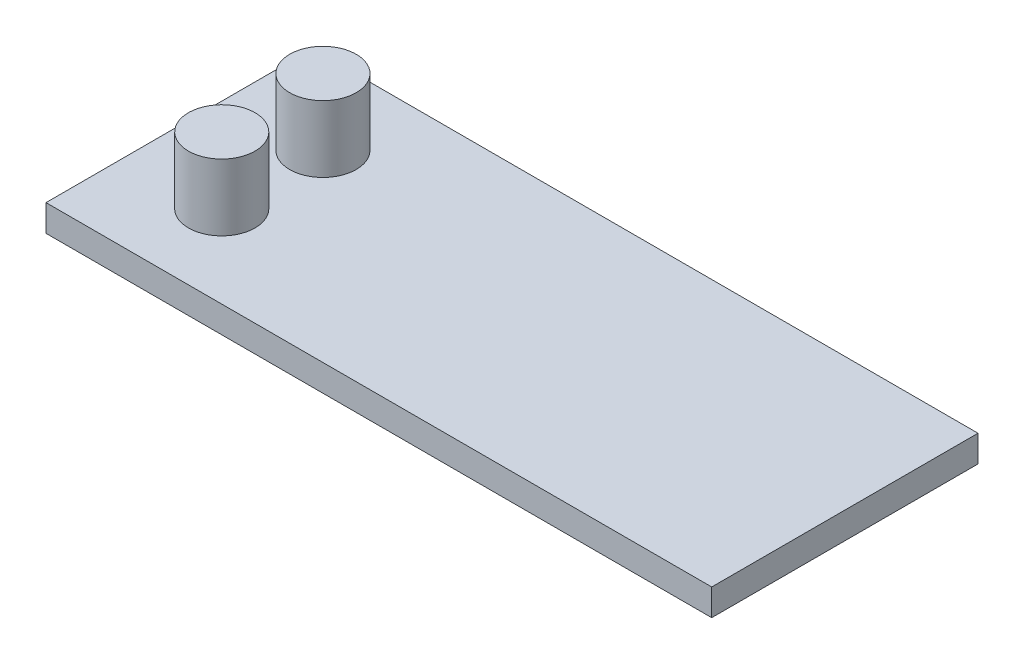
ISO-10303-21;
HEADER;
FILE_DESCRIPTION(('STEP AP214'),'2;1');
FILE_NAME('part.step','',(''),(''),'','','');
FILE_SCHEMA(('AUTOMOTIVE_DESIGN { 1 0 10303 214 1 1 1 1 }'));
ENDSEC;
DATA;
#1=APPLICATION_CONTEXT('core data for automotive mechanical design processes');
#2=APPLICATION_PROTOCOL_DEFINITION('international standard','automotive_design',2000,#1);
#3=PRODUCT_CONTEXT('',#1,'mechanical');
#4=PRODUCT('Part','Part','',(#3));
#5=PRODUCT_RELATED_PRODUCT_CATEGORY('part','',(#4));
#6=PRODUCT_DEFINITION_FORMATION('','',#4);
#7=PRODUCT_DEFINITION_CONTEXT('part definition',#1,'design');
#8=PRODUCT_DEFINITION('design','',#6,#7);
#9=PRODUCT_DEFINITION_SHAPE('','',#8);
#10=(LENGTH_UNIT() NAMED_UNIT(*) SI_UNIT(.MILLI.,.METRE.));
#11=(NAMED_UNIT(*) PLANE_ANGLE_UNIT() SI_UNIT($,.RADIAN.));
#12=(NAMED_UNIT(*) SI_UNIT($,.STERADIAN.) SOLID_ANGLE_UNIT());
#13=UNCERTAINTY_MEASURE_WITH_UNIT(LENGTH_MEASURE(1.E-05),#10,'distance_accuracy_value','');
#14=(GEOMETRIC_REPRESENTATION_CONTEXT(3) GLOBAL_UNCERTAINTY_ASSIGNED_CONTEXT((#13)) GLOBAL_UNIT_ASSIGNED_CONTEXT((#10,
#11,#12)) REPRESENTATION_CONTEXT('',''));
#15=CARTESIAN_POINT('',(0.,0.,0.));
#16=DIRECTION('',(0.,0.,1.));
#17=DIRECTION('',(1.,0.,0.));
#18=AXIS2_PLACEMENT_3D('',#15,#16,#17);
#19=CARTESIAN_POINT('',(0.,2.,0.));
#20=DIRECTION('',(0.,1.,0.));
#21=DIRECTION('',(0.,0.,1.));
#22=AXIS2_PLACEMENT_3D('',#19,#20,#21);
#23=PLANE('',#22);
#24=CARTESIAN_POINT('',(-18.,2.,3.8));
#25=DIRECTION('',(0.,1.,0.));
#26=DIRECTION('',(0.,0.,1.));
#27=AXIS2_PLACEMENT_3D('',#24,#25,#26);
#28=CIRCLE('',#27,2.5);
#29=CARTESIAN_POINT('',(-18.,2.,6.3));
#30=VERTEX_POINT('',#29);
#31=EDGE_CURVE('E181',#30,#30,#28,.T.);
#32=ORIENTED_EDGE('',*,*,#31,.F.);
#33=EDGE_LOOP('',(#32));
#34=FACE_BOUND('',#33,.T.);
#35=DIRECTION('',(1.,0.,0.));
#36=VECTOR('',#35,1.);
#37=CARTESIAN_POINT('',(-25.,2.,-10.));
#38=LINE('',#37,#36);
#39=CARTESIAN_POINT('',(-25.,2.,-10.));
#40=VERTEX_POINT('',#39);
#41=CARTESIAN_POINT('',(25.,2.,-10.));
#42=VERTEX_POINT('',#41);
#43=EDGE_CURVE('E125',#40,#42,#38,.T.);
#44=ORIENTED_EDGE('',*,*,#43,.F.);
#45=DIRECTION('',(0.,0.,-1.));
#46=VECTOR('',#45,1.);
#47=CARTESIAN_POINT('',(-25.,2.,10.));
#48=LINE('',#47,#46);
#49=CARTESIAN_POINT('',(-25.,2.,10.));
#50=VERTEX_POINT('',#49);
#51=EDGE_CURVE('E115',#50,#40,#48,.T.);
#52=ORIENTED_EDGE('',*,*,#51,.F.);
#53=DIRECTION('',(1.,0.,0.));
#54=VECTOR('',#53,1.);
#55=CARTESIAN_POINT('',(-25.,2.,10.));
#56=LINE('',#55,#54);
#57=CARTESIAN_POINT('',(25.,2.,10.));
#58=VERTEX_POINT('',#57);
#59=EDGE_CURVE('E112',#50,#58,#56,.T.);
#60=ORIENTED_EDGE('',*,*,#59,.T.);
#61=DIRECTION('',(0.,0.,-1.));
#62=VECTOR('',#61,1.);
#63=CARTESIAN_POINT('',(25.,2.,10.));
#64=LINE('',#63,#62);
#65=EDGE_CURVE('E109',#58,#42,#64,.T.);
#66=ORIENTED_EDGE('',*,*,#65,.T.);
#67=EDGE_LOOP('',(#44,#52,#60,#66));
#68=FACE_BOUND('',#67,.T.);
#69=CARTESIAN_POINT('',(-18.,2.,-3.8));
#70=DIRECTION('',(0.,1.,0.));
#71=DIRECTION('',(0.,0.,1.));
#72=AXIS2_PLACEMENT_3D('',#69,#70,#71);
#73=CIRCLE('',#72,2.5);
#74=CARTESIAN_POINT('',(-18.,2.,-1.3));
#75=VERTEX_POINT('',#74);
#76=EDGE_CURVE('E136',#75,#75,#73,.T.);
#77=ORIENTED_EDGE('',*,*,#76,.F.);
#78=EDGE_LOOP('',(#77));
#79=FACE_BOUND('',#78,.T.);
#80=ADVANCED_FACE('F66',(#34,#68,#79),#23,.T.);
#81=CARTESIAN_POINT('',(0.,0.,0.));
#82=DIRECTION('',(0.,1.,0.));
#83=DIRECTION('',(0.,0.,1.));
#84=AXIS2_PLACEMENT_3D('',#81,#82,#83);
#85=PLANE('',#84);
#86=DIRECTION('',(1.,0.,0.));
#87=VECTOR('',#86,1.);
#88=CARTESIAN_POINT('',(-25.,0.,-10.));
#89=LINE('',#88,#87);
#90=CARTESIAN_POINT('',(-25.,0.,-10.));
#91=VERTEX_POINT('',#90);
#92=CARTESIAN_POINT('',(25.,0.,-10.));
#93=VERTEX_POINT('',#92);
#94=EDGE_CURVE('E132',#91,#93,#89,.T.);
#95=ORIENTED_EDGE('',*,*,#94,.T.);
#96=DIRECTION('',(0.,0.,-1.));
#97=VECTOR('',#96,1.);
#98=CARTESIAN_POINT('',(25.,0.,10.));
#99=LINE('',#98,#97);
#100=CARTESIAN_POINT('',(25.,0.,10.));
#101=VERTEX_POINT('',#100);
#102=EDGE_CURVE('E135',#101,#93,#99,.T.);
#103=ORIENTED_EDGE('',*,*,#102,.F.);
#104=DIRECTION('',(1.,0.,0.));
#105=VECTOR('',#104,1.);
#106=CARTESIAN_POINT('',(-25.,0.,10.));
#107=LINE('',#106,#105);
#108=CARTESIAN_POINT('',(-25.,0.,10.));
#109=VERTEX_POINT('',#108);
#110=EDGE_CURVE('E120',#109,#101,#107,.T.);
#111=ORIENTED_EDGE('',*,*,#110,.F.);
#112=DIRECTION('',(0.,0.,-1.));
#113=VECTOR('',#112,1.);
#114=CARTESIAN_POINT('',(-25.,0.,10.));
#115=LINE('',#114,#113);
#116=EDGE_CURVE('E127',#109,#91,#115,.T.);
#117=ORIENTED_EDGE('',*,*,#116,.T.);
#118=EDGE_LOOP('',(#95,#103,#111,#117));
#119=FACE_BOUND('',#118,.T.);
#120=ADVANCED_FACE('F142',(#119),#85,.F.);
#121=CARTESIAN_POINT('',(-25.,2.,-10.));
#122=DIRECTION('',(0.,0.,-1.));
#123=DIRECTION('',(-1.,0.,0.));
#124=AXIS2_PLACEMENT_3D('',#121,#122,#123);
#125=PLANE('',#124);
#126=ORIENTED_EDGE('',*,*,#94,.F.);
#127=DIRECTION('',(0.,-1.,0.));
#128=VECTOR('',#127,1.);
#129=CARTESIAN_POINT('',(-25.,2.,-10.));
#130=LINE('',#129,#128);
#131=EDGE_CURVE('E12',#40,#91,#130,.T.);
#132=ORIENTED_EDGE('',*,*,#131,.F.);
#133=ORIENTED_EDGE('',*,*,#43,.T.);
#134=DIRECTION('',(0.,-1.,0.));
#135=VECTOR('',#134,1.);
#136=CARTESIAN_POINT('',(25.,2.,-10.));
#137=LINE('',#136,#135);
#138=EDGE_CURVE('E70',#42,#93,#137,.T.);
#139=ORIENTED_EDGE('',*,*,#138,.T.);
#140=EDGE_LOOP('',(#126,#132,#133,#139));
#141=FACE_BOUND('',#140,.T.);
#142=ADVANCED_FACE('F68',(#141),#125,.T.);
#143=CARTESIAN_POINT('',(-25.,2.,10.));
#144=DIRECTION('',(-1.,0.,0.));
#145=DIRECTION('',(0.,0.,1.));
#146=AXIS2_PLACEMENT_3D('',#143,#144,#145);
#147=PLANE('',#146);
#148=ORIENTED_EDGE('',*,*,#116,.F.);
#149=DIRECTION('',(0.,-1.,0.));
#150=VECTOR('',#149,1.);
#151=CARTESIAN_POINT('',(-25.,2.,10.));
#152=LINE('',#151,#150);
#153=EDGE_CURVE('E76',#50,#109,#152,.T.);
#154=ORIENTED_EDGE('',*,*,#153,.F.);
#155=ORIENTED_EDGE('',*,*,#51,.T.);
#156=ORIENTED_EDGE('',*,*,#131,.T.);
#157=EDGE_LOOP('',(#148,#154,#155,#156));
#158=FACE_BOUND('',#157,.T.);
#159=ADVANCED_FACE('F143',(#158),#147,.T.);
#160=CARTESIAN_POINT('',(-25.,2.,10.));
#161=DIRECTION('',(0.,0.,-1.));
#162=DIRECTION('',(-1.,0.,0.));
#163=AXIS2_PLACEMENT_3D('',#160,#161,#162);
#164=PLANE('',#163);
#165=ORIENTED_EDGE('',*,*,#110,.T.);
#166=DIRECTION('',(0.,-1.,0.));
#167=VECTOR('',#166,1.);
#168=CARTESIAN_POINT('',(25.,2.,10.));
#169=LINE('',#168,#167);
#170=EDGE_CURVE('E118',#58,#101,#169,.T.);
#171=ORIENTED_EDGE('',*,*,#170,.F.);
#172=ORIENTED_EDGE('',*,*,#59,.F.);
#173=ORIENTED_EDGE('',*,*,#153,.T.);
#174=EDGE_LOOP('',(#165,#171,#172,#173));
#175=FACE_BOUND('',#174,.T.);
#176=ADVANCED_FACE('F119',(#175),#164,.F.);
#177=CARTESIAN_POINT('',(25.,2.,10.));
#178=DIRECTION('',(-1.,0.,0.));
#179=DIRECTION('',(0.,0.,1.));
#180=AXIS2_PLACEMENT_3D('',#177,#178,#179);
#181=PLANE('',#180);
#182=ORIENTED_EDGE('',*,*,#102,.T.);
#183=ORIENTED_EDGE('',*,*,#138,.F.);
#184=ORIENTED_EDGE('',*,*,#65,.F.);
#185=ORIENTED_EDGE('',*,*,#170,.T.);
#186=EDGE_LOOP('',(#182,#183,#184,#185));
#187=FACE_BOUND('',#186,.T.);
#188=ADVANCED_FACE('F124',(#187),#181,.F.);
#189=CARTESIAN_POINT('',(-18.,7.,-3.8));
#190=DIRECTION('',(0.,-1.,0.));
#191=DIRECTION('',(0.,0.,-1.));
#192=AXIS2_PLACEMENT_3D('',#189,#190,#191);
#193=CYLINDRICAL_SURFACE('',#192,2.5);
#194=ORIENTED_EDGE('',*,*,#76,.T.);
#195=EDGE_LOOP('',(#194));
#196=FACE_BOUND('',#195,.T.);
#197=CARTESIAN_POINT('',(-18.,7.,-3.8));
#198=DIRECTION('',(0.,1.,0.));
#199=DIRECTION('',(0.,0.,1.));
#200=AXIS2_PLACEMENT_3D('',#197,#198,#199);
#201=CIRCLE('',#200,2.5);
#202=CARTESIAN_POINT('',(-18.,7.,-1.3));
#203=VERTEX_POINT('',#202);
#204=EDGE_CURVE('E184',#203,#203,#201,.T.);
#205=ORIENTED_EDGE('',*,*,#204,.F.);
#206=EDGE_LOOP('',(#205));
#207=FACE_BOUND('',#206,.T.);
#208=ADVANCED_FACE('F160',(#196,#207),#193,.T.);
#209=CARTESIAN_POINT('',(0.,7.,0.));
#210=DIRECTION('',(0.,1.,0.));
#211=DIRECTION('',(0.,0.,1.));
#212=AXIS2_PLACEMENT_3D('',#209,#210,#211);
#213=PLANE('',#212);
#214=ORIENTED_EDGE('',*,*,#204,.T.);
#215=EDGE_LOOP('',(#214));
#216=FACE_BOUND('',#215,.T.);
#217=ADVANCED_FACE('F163',(#216),#213,.T.);
#218=CARTESIAN_POINT('',(-18.,7.,3.8));
#219=DIRECTION('',(0.,-1.,0.));
#220=DIRECTION('',(0.,0.,-1.));
#221=AXIS2_PLACEMENT_3D('',#218,#219,#220);
#222=CYLINDRICAL_SURFACE('',#221,2.5);
#223=ORIENTED_EDGE('',*,*,#31,.T.);
#224=EDGE_LOOP('',(#223));
#225=FACE_BOUND('',#224,.T.);
#226=CARTESIAN_POINT('',(-18.,7.,3.8));
#227=DIRECTION('',(0.,1.,0.));
#228=DIRECTION('',(0.,0.,1.));
#229=AXIS2_PLACEMENT_3D('',#226,#227,#228);
#230=CIRCLE('',#229,2.5);
#231=CARTESIAN_POINT('',(-18.,7.,6.3));
#232=VERTEX_POINT('',#231);
#233=EDGE_CURVE('E179',#232,#232,#230,.F.);
#234=ORIENTED_EDGE('',*,*,#233,.T.);
#235=EDGE_LOOP('',(#234));
#236=FACE_BOUND('',#235,.T.);
#237=ADVANCED_FACE('F167',(#225,#236),#222,.T.);
#238=CARTESIAN_POINT('',(0.,7.,0.));
#239=DIRECTION('',(0.,1.,0.));
#240=DIRECTION('',(0.,0.,1.));
#241=AXIS2_PLACEMENT_3D('',#238,#239,#240);
#242=PLANE('',#241);
#243=ORIENTED_EDGE('',*,*,#233,.F.);
#244=EDGE_LOOP('',(#243));
#245=FACE_BOUND('',#244,.T.);
#246=ADVANCED_FACE('F171',(#245),#242,.T.);
#247=CLOSED_SHELL('',(#80,#120,#142,#159,#176,#188,#208,#217,#237,#246));
#248=MANIFOLD_SOLID_BREP('B2',#247);
#249=ADVANCED_BREP_SHAPE_REPRESENTATION('',(#18,#248),#14);
#250=SHAPE_DEFINITION_REPRESENTATION(#9,#249);
ENDSEC;
END-ISO-10303-21;
